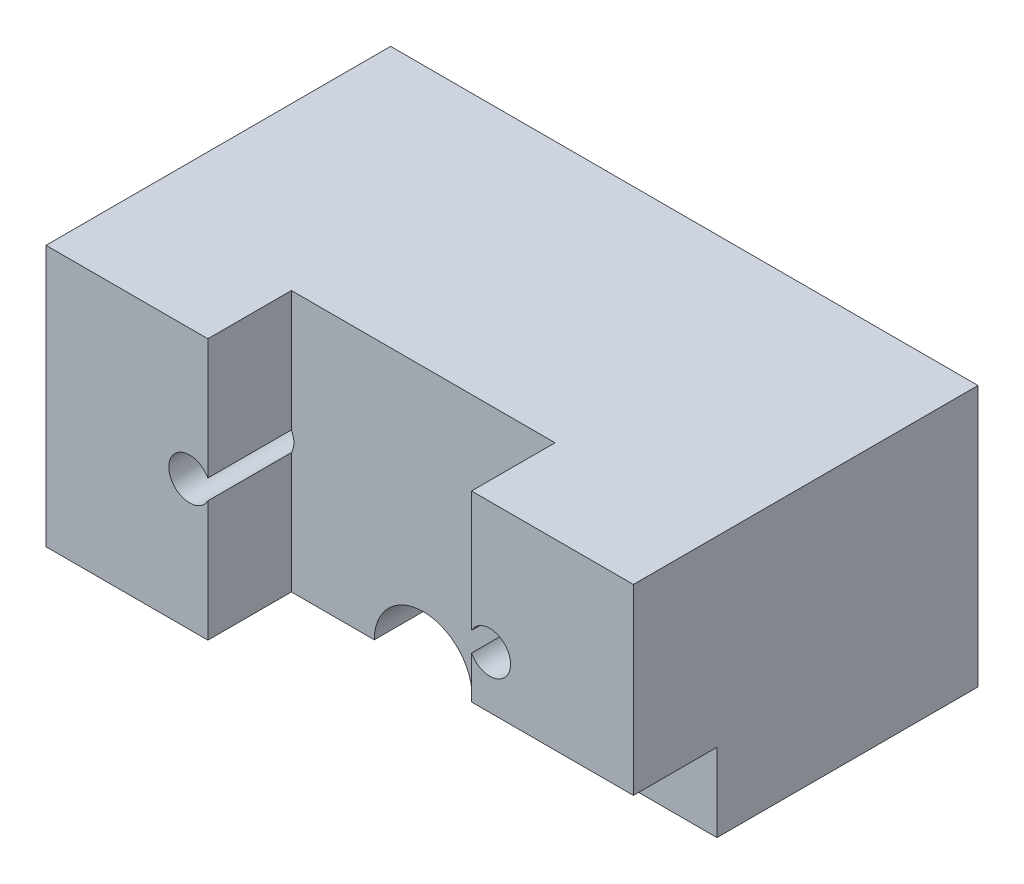
ISO-10303-21;
HEADER;
FILE_DESCRIPTION(('STEP AP214'),'2;1');
FILE_NAME('part.step','',(''),(''),'','','');
FILE_SCHEMA(('AUTOMOTIVE_DESIGN { 1 0 10303 214 1 1 1 1 }'));
ENDSEC;
DATA;
#1=APPLICATION_CONTEXT('core data for automotive mechanical design processes');
#2=APPLICATION_PROTOCOL_DEFINITION('international standard','automotive_design',2000,#1);
#3=PRODUCT_CONTEXT('',#1,'mechanical');
#4=PRODUCT('Part','Part','',(#3));
#5=PRODUCT_RELATED_PRODUCT_CATEGORY('part','',(#4));
#6=PRODUCT_DEFINITION_FORMATION('','',#4);
#7=PRODUCT_DEFINITION_CONTEXT('part definition',#1,'design');
#8=PRODUCT_DEFINITION('design','',#6,#7);
#9=PRODUCT_DEFINITION_SHAPE('','',#8);
#10=(LENGTH_UNIT() NAMED_UNIT(*) SI_UNIT(.MILLI.,.METRE.));
#11=(NAMED_UNIT(*) PLANE_ANGLE_UNIT() SI_UNIT($,.RADIAN.));
#12=(NAMED_UNIT(*) SI_UNIT($,.STERADIAN.) SOLID_ANGLE_UNIT());
#13=UNCERTAINTY_MEASURE_WITH_UNIT(LENGTH_MEASURE(1.E-05),#10,'distance_accuracy_value','');
#14=(GEOMETRIC_REPRESENTATION_CONTEXT(3) GLOBAL_UNCERTAINTY_ASSIGNED_CONTEXT((#13)) GLOBAL_UNIT_ASSIGNED_CONTEXT((#10,
#11,#12)) REPRESENTATION_CONTEXT('',''));
#15=CARTESIAN_POINT('',(0.,0.,0.));
#16=DIRECTION('',(0.,0.,1.));
#17=DIRECTION('',(1.,0.,0.));
#18=AXIS2_PLACEMENT_3D('',#15,#16,#17);
#19=CARTESIAN_POINT('',(0.,0.,-10.922));
#20=DIRECTION('',(0.,0.,-1.));
#21=DIRECTION('',(-1.,0.,0.));
#22=AXIS2_PLACEMENT_3D('',#19,#20,#21);
#23=PLANE('',#22);
#24=DIRECTION('',(0.,-1.,0.));
#25=VECTOR('',#24,1.);
#26=CARTESIAN_POINT('',(12.827,12.7,-10.922));
#27=LINE('',#26,#25);
#28=CARTESIAN_POINT('',(12.827,12.7,-10.922));
#29=VERTEX_POINT('',#28);
#30=CARTESIAN_POINT('',(12.827,0.957229591059528,-10.922));
#31=VERTEX_POINT('',#30);
#32=EDGE_CURVE('E43',#29,#31,#27,.T.);
#33=ORIENTED_EDGE('',*,*,#32,.T.);
#34=CARTESIAN_POINT('',(14.605,0.,-10.922));
#35=DIRECTION('',(0.,0.,-1.));
#36=DIRECTION('',(-1.,0.,0.));
#37=AXIS2_PLACEMENT_3D('',#34,#35,#36);
#38=CIRCLE('',#37,2.0193);
#39=CARTESIAN_POINT('',(12.827,-0.957229591059528,-10.922));
#40=VERTEX_POINT('',#39);
#41=EDGE_CURVE('E51',#40,#31,#38,.F.);
#42=ORIENTED_EDGE('',*,*,#41,.F.);
#43=CARTESIAN_POINT('',(12.827,-5.08,-10.922));
#44=VERTEX_POINT('',#43);
#45=EDGE_CURVE('E11',#40,#44,#27,.T.);
#46=ORIENTED_EDGE('',*,*,#45,.T.);
#47=DIRECTION('',(-1.,0.,0.));
#48=VECTOR('',#47,1.);
#49=CARTESIAN_POINT('',(12.827,-5.08,-10.922));
#50=LINE('',#49,#48);
#51=CARTESIAN_POINT('',(28.575,-5.08,-10.922));
#52=VERTEX_POINT('',#51);
#53=EDGE_CURVE('E197',#52,#44,#50,.T.);
#54=ORIENTED_EDGE('',*,*,#53,.F.);
#55=DIRECTION('',(0.,1.,0.));
#56=VECTOR('',#55,1.);
#57=CARTESIAN_POINT('',(28.575,-12.7,-10.922));
#58=LINE('',#57,#56);
#59=CARTESIAN_POINT('',(28.575,12.7,-10.922));
#60=VERTEX_POINT('',#59);
#61=EDGE_CURVE('E278',#52,#60,#58,.T.);
#62=ORIENTED_EDGE('',*,*,#61,.T.);
#63=DIRECTION('',(1.,0.,0.));
#64=VECTOR('',#63,1.);
#65=CARTESIAN_POINT('',(0.,12.7,-10.922));
#66=LINE('',#65,#64);
#67=EDGE_CURVE('E58',#29,#60,#66,.T.);
#68=ORIENTED_EDGE('',*,*,#67,.F.);
#69=EDGE_LOOP('',(#33,#42,#46,#54,#62,#68));
#70=FACE_BOUND('',#69,.T.);
#71=ADVANCED_FACE('F35',(#70),#23,.F.);
#72=CARTESIAN_POINT('',(12.7,-3.302,-28.575));
#73=DIRECTION('',(0.,-1.,0.));
#74=DIRECTION('',(0.,0.,-1.));
#75=AXIS2_PLACEMENT_3D('',#72,#73,#74);
#76=CONICAL_SURFACE('',#75,1.35255,1.02974425867665);
#77=CARTESIAN_POINT('',(12.7,-2.48930596973427,-28.575));
#78=VERTEX_POINT('',#77);
#79=VERTEX_LOOP('',#78);
#80=FACE_BOUND('',#79,.T.);
#81=CARTESIAN_POINT('',(12.7,-3.302,-28.575));
#82=DIRECTION('',(0.,-1.,0.));
#83=DIRECTION('',(0.,0.,-1.));
#84=AXIS2_PLACEMENT_3D('',#81,#82,#83);
#85=CIRCLE('',#84,1.35255);
#86=CARTESIAN_POINT('',(12.7,-3.302,-29.92755));
#87=VERTEX_POINT('',#86);
#88=EDGE_CURVE('E162',#87,#87,#85,.T.);
#89=ORIENTED_EDGE('',*,*,#88,.T.);
#90=EDGE_LOOP('',(#89));
#91=FACE_BOUND('',#90,.T.);
#92=ADVANCED_FACE('F350',(#80,#91),#76,.F.);
#93=CARTESIAN_POINT('',(12.7,-12.7,-28.575));
#94=DIRECTION('',(0.,-1.,0.));
#95=DIRECTION('',(0.,0.,-1.));
#96=AXIS2_PLACEMENT_3D('',#93,#94,#95);
#97=CYLINDRICAL_SURFACE('',#96,1.35255);
#98=ORIENTED_EDGE('',*,*,#88,.F.);
#99=EDGE_LOOP('',(#98));
#100=FACE_BOUND('',#99,.T.);
#101=CARTESIAN_POINT('',(12.7,-12.7,-28.575));
#102=DIRECTION('',(0.,-1.,0.));
#103=DIRECTION('',(0.,0.,-1.));
#104=AXIS2_PLACEMENT_3D('',#101,#102,#103);
#105=CIRCLE('',#104,1.35255);
#106=CARTESIAN_POINT('',(12.7,-12.7,-29.92755));
#107=VERTEX_POINT('',#106);
#108=EDGE_CURVE('E158',#107,#107,#105,.T.);
#109=ORIENTED_EDGE('',*,*,#108,.T.);
#110=EDGE_LOOP('',(#109));
#111=FACE_BOUND('',#110,.T.);
#112=ADVANCED_FACE('F152',(#100,#111),#97,.F.);
#113=CARTESIAN_POINT('',(-12.7,-3.302,-28.575));
#114=DIRECTION('',(0.,-1.,0.));
#115=DIRECTION('',(0.,0.,-1.));
#116=AXIS2_PLACEMENT_3D('',#113,#114,#115);
#117=CONICAL_SURFACE('',#116,1.35255,1.02974425867665);
#118=CARTESIAN_POINT('',(-12.7,-2.48930596973427,-28.575));
#119=VERTEX_POINT('',#118);
#120=VERTEX_LOOP('',#119);
#121=FACE_BOUND('',#120,.T.);
#122=CARTESIAN_POINT('',(-12.7,-3.302,-28.575));
#123=DIRECTION('',(0.,-1.,0.));
#124=DIRECTION('',(0.,0.,-1.));
#125=AXIS2_PLACEMENT_3D('',#122,#123,#124);
#126=CIRCLE('',#125,1.35255);
#127=CARTESIAN_POINT('',(-12.7,-3.302,-29.92755));
#128=VERTEX_POINT('',#127);
#129=EDGE_CURVE('E156',#128,#128,#126,.T.);
#130=ORIENTED_EDGE('',*,*,#129,.T.);
#131=EDGE_LOOP('',(#130));
#132=FACE_BOUND('',#131,.T.);
#133=ADVANCED_FACE('F148',(#121,#132),#117,.F.);
#134=CARTESIAN_POINT('',(14.605,0.,-38.989));
#135=DIRECTION('',(0.,0.,-1.));
#136=DIRECTION('',(-1.,0.,0.));
#137=AXIS2_PLACEMENT_3D('',#134,#135,#136);
#138=CYLINDRICAL_SURFACE('',#137,4.2164);
#139=CARTESIAN_POINT('',(14.605,0.,-38.989));
#140=DIRECTION('',(0.,0.,-1.));
#141=DIRECTION('',(-1.,0.,0.));
#142=AXIS2_PLACEMENT_3D('',#139,#140,#141);
#143=CIRCLE('',#142,4.2164);
#144=CARTESIAN_POINT('',(10.3886,0.,-38.989));
#145=VERTEX_POINT('',#144);
#146=EDGE_CURVE('E176',#145,#145,#143,.T.);
#147=ORIENTED_EDGE('',*,*,#146,.F.);
#148=EDGE_LOOP('',(#147));
#149=FACE_BOUND('',#148,.T.);
#150=CARTESIAN_POINT('',(14.605,0.,-44.45));
#151=DIRECTION('',(0.,0.,-1.));
#152=DIRECTION('',(-1.,0.,0.));
#153=AXIS2_PLACEMENT_3D('',#150,#151,#152);
#154=CIRCLE('',#153,4.2164);
#155=CARTESIAN_POINT('',(10.3886,0.,-44.45));
#156=VERTEX_POINT('',#155);
#157=EDGE_CURVE('E180',#156,#156,#154,.T.);
#158=ORIENTED_EDGE('',*,*,#157,.T.);
#159=EDGE_LOOP('',(#158));
#160=FACE_BOUND('',#159,.T.);
#161=ADVANCED_FACE('F151',(#149,#160),#138,.F.);
#162=CARTESIAN_POINT('',(-14.605,0.,-38.989));
#163=DIRECTION('',(0.,0.,-1.));
#164=DIRECTION('',(-1.,0.,0.));
#165=AXIS2_PLACEMENT_3D('',#162,#163,#164);
#166=CYLINDRICAL_SURFACE('',#165,4.2164);
#167=CARTESIAN_POINT('',(-14.605,0.,-38.989));
#168=DIRECTION('',(0.,0.,-1.));
#169=DIRECTION('',(-1.,0.,0.));
#170=AXIS2_PLACEMENT_3D('',#167,#168,#169);
#171=CIRCLE('',#170,4.2164);
#172=CARTESIAN_POINT('',(-18.8214,0.,-38.989));
#173=VERTEX_POINT('',#172);
#174=EDGE_CURVE('E170',#173,#173,#171,.T.);
#175=ORIENTED_EDGE('',*,*,#174,.F.);
#176=EDGE_LOOP('',(#175));
#177=FACE_BOUND('',#176,.T.);
#178=CARTESIAN_POINT('',(-14.605,0.,-44.45));
#179=DIRECTION('',(0.,0.,-1.));
#180=DIRECTION('',(-1.,0.,0.));
#181=AXIS2_PLACEMENT_3D('',#178,#179,#180);
#182=CIRCLE('',#181,4.2164);
#183=CARTESIAN_POINT('',(-18.8214,0.,-44.45));
#184=VERTEX_POINT('',#183);
#185=EDGE_CURVE('E169',#184,#184,#182,.T.);
#186=ORIENTED_EDGE('',*,*,#185,.T.);
#187=EDGE_LOOP('',(#186));
#188=FACE_BOUND('',#187,.T.);
#189=ADVANCED_FACE('F476',(#177,#188),#166,.F.);
#190=CARTESIAN_POINT('',(-14.605,0.,-38.989));
#191=DIRECTION('',(0.,0.,-1.));
#192=DIRECTION('',(-1.,0.,0.));
#193=AXIS2_PLACEMENT_3D('',#190,#191,#192);
#194=PLANE('',#193);
#195=ORIENTED_EDGE('',*,*,#174,.T.);
#196=EDGE_LOOP('',(#195));
#197=FACE_BOUND('',#196,.T.);
#198=CARTESIAN_POINT('',(-14.605,0.,-38.989));
#199=DIRECTION('',(0.,0.,-1.));
#200=DIRECTION('',(-1.,0.,0.));
#201=AXIS2_PLACEMENT_3D('',#198,#199,#200);
#202=CIRCLE('',#201,2.0193);
#203=CARTESIAN_POINT('',(-16.6243,0.,-38.989));
#204=VERTEX_POINT('',#203);
#205=EDGE_CURVE('E173',#204,#204,#202,.F.);
#206=ORIENTED_EDGE('',*,*,#205,.T.);
#207=EDGE_LOOP('',(#206));
#208=FACE_BOUND('',#207,.T.);
#209=ADVANCED_FACE('F471',(#197,#208),#194,.T.);
#210=CARTESIAN_POINT('',(14.605,0.,-38.989));
#211=DIRECTION('',(0.,0.,-1.));
#212=DIRECTION('',(-1.,0.,0.));
#213=AXIS2_PLACEMENT_3D('',#210,#211,#212);
#214=PLANE('',#213);
#215=ORIENTED_EDGE('',*,*,#146,.T.);
#216=EDGE_LOOP('',(#215));
#217=FACE_BOUND('',#216,.T.);
#218=CARTESIAN_POINT('',(14.605,0.,-38.989));
#219=DIRECTION('',(0.,0.,-1.));
#220=DIRECTION('',(-1.,0.,0.));
#221=AXIS2_PLACEMENT_3D('',#218,#219,#220);
#222=CIRCLE('',#221,2.0193);
#223=CARTESIAN_POINT('',(12.5857,0.,-38.989));
#224=VERTEX_POINT('',#223);
#225=EDGE_CURVE('E179',#224,#224,#222,.F.);
#226=ORIENTED_EDGE('',*,*,#225,.T.);
#227=EDGE_LOOP('',(#226));
#228=FACE_BOUND('',#227,.T.);
#229=ADVANCED_FACE('F371',(#217,#228),#214,.T.);
#230=CARTESIAN_POINT('',(0.,-12.7,0.));
#231=DIRECTION('',(0.,-1.,0.));
#232=DIRECTION('',(0.,0.,-1.));
#233=AXIS2_PLACEMENT_3D('',#230,#231,#232);
#234=PLANE('',#233);
#235=ORIENTED_EDGE('',*,*,#108,.F.);
#236=EDGE_LOOP('',(#235));
#237=FACE_BOUND('',#236,.T.);
#238=DIRECTION('',(0.,0.,-1.));
#239=VECTOR('',#238,1.);
#240=CARTESIAN_POINT('',(28.575,-12.7,44.45));
#241=LINE('',#240,#239);
#242=CARTESIAN_POINT('',(28.575,-12.7,-19.05));
#243=VERTEX_POINT('',#242);
#244=CARTESIAN_POINT('',(28.575,-12.7,-44.45));
#245=VERTEX_POINT('',#244);
#246=EDGE_CURVE('E248',#243,#245,#241,.T.);
#247=ORIENTED_EDGE('',*,*,#246,.F.);
#248=DIRECTION('',(-1.,0.,0.));
#249=VECTOR('',#248,1.);
#250=CARTESIAN_POINT('',(12.827,-12.7,-19.05));
#251=LINE('',#250,#249);
#252=CARTESIAN_POINT('',(4.7625,-12.7,-19.05));
#253=VERTEX_POINT('',#252);
#254=EDGE_CURVE('E206',#243,#253,#251,.T.);
#255=ORIENTED_EDGE('',*,*,#254,.T.);
#256=DIRECTION('',(0.,0.,-1.));
#257=VECTOR('',#256,1.);
#258=CARTESIAN_POINT('',(4.7625,-12.7,-19.05));
#259=LINE('',#258,#257);
#260=CARTESIAN_POINT('',(4.7625,-12.7,-44.45));
#261=VERTEX_POINT('',#260);
#262=EDGE_CURVE('E260',#261,#253,#259,.F.);
#263=ORIENTED_EDGE('',*,*,#262,.F.);
#264=DIRECTION('',(-1.,0.,0.));
#265=VECTOR('',#264,1.);
#266=CARTESIAN_POINT('',(-28.575,-12.7,-44.45));
#267=LINE('',#266,#265);
#268=EDGE_CURVE('E251',#245,#261,#267,.T.);
#269=ORIENTED_EDGE('',*,*,#268,.F.);
#270=EDGE_LOOP('',(#247,#255,#263,#269));
#271=FACE_BOUND('',#270,.T.);
#272=ADVANCED_FACE('F329',(#237,#271),#234,.T.);
#273=CARTESIAN_POINT('',(-12.7,-12.7,-28.575));
#274=DIRECTION('',(0.,-1.,0.));
#275=DIRECTION('',(0.,0.,-1.));
#276=AXIS2_PLACEMENT_3D('',#273,#274,#275);
#277=CYLINDRICAL_SURFACE('',#276,1.35255);
#278=ORIENTED_EDGE('',*,*,#129,.F.);
#279=EDGE_LOOP('',(#278));
#280=FACE_BOUND('',#279,.T.);
#281=CARTESIAN_POINT('',(-12.7,-12.7,-28.575));
#282=DIRECTION('',(0.,-1.,0.));
#283=DIRECTION('',(0.,0.,-1.));
#284=AXIS2_PLACEMENT_3D('',#281,#282,#283);
#285=CIRCLE('',#284,1.35255);
#286=CARTESIAN_POINT('',(-12.7,-12.7,-29.92755));
#287=VERTEX_POINT('',#286);
#288=EDGE_CURVE('E159',#287,#287,#285,.T.);
#289=ORIENTED_EDGE('',*,*,#288,.T.);
#290=EDGE_LOOP('',(#289));
#291=FACE_BOUND('',#290,.T.);
#292=ADVANCED_FACE('F367',(#280,#291),#277,.F.);
#293=CARTESIAN_POINT('',(0.,-12.7,-19.05));
#294=DIRECTION('',(0.,0.,-1.));
#295=DIRECTION('',(-1.,0.,0.));
#296=AXIS2_PLACEMENT_3D('',#293,#294,#295);
#297=CYLINDRICAL_SURFACE('',#296,4.7625);
#298=DIRECTION('',(0.,0.,-1.));
#299=VECTOR('',#298,1.);
#300=CARTESIAN_POINT('',(-4.7625,-12.7,-19.05));
#301=LINE('',#300,#299);
#302=CARTESIAN_POINT('',(-4.7625,-12.7,-19.05));
#303=VERTEX_POINT('',#302);
#304=CARTESIAN_POINT('',(-4.7625,-12.7,-44.45));
#305=VERTEX_POINT('',#304);
#306=EDGE_CURVE('E265',#303,#305,#301,.T.);
#307=ORIENTED_EDGE('',*,*,#306,.T.);
#308=CARTESIAN_POINT('',(0.,-12.7,-44.45));
#309=DIRECTION('',(0.,0.,-1.));
#310=DIRECTION('',(-1.,0.,0.));
#311=AXIS2_PLACEMENT_3D('',#308,#309,#310);
#312=CIRCLE('',#311,4.7625);
#313=EDGE_CURVE('E236',#305,#261,#312,.T.);
#314=ORIENTED_EDGE('',*,*,#313,.T.);
#315=ORIENTED_EDGE('',*,*,#262,.T.);
#316=CARTESIAN_POINT('',(0.,-12.7,-19.05));
#317=DIRECTION('',(0.,0.,-1.));
#318=DIRECTION('',(-1.,0.,0.));
#319=AXIS2_PLACEMENT_3D('',#316,#317,#318);
#320=CIRCLE('',#319,4.7625);
#321=EDGE_CURVE('E237',#303,#253,#320,.T.);
#322=ORIENTED_EDGE('',*,*,#321,.F.);
#323=EDGE_LOOP('',(#307,#314,#315,#322));
#324=FACE_BOUND('',#323,.T.);
#325=ADVANCED_FACE('F321',(#324),#297,.F.);
#326=CARTESIAN_POINT('',(-28.575,-12.7,-44.45));
#327=DIRECTION('',(0.,0.,-1.));
#328=DIRECTION('',(-1.,0.,0.));
#329=AXIS2_PLACEMENT_3D('',#326,#327,#328);
#330=PLANE('',#329);
#331=ORIENTED_EDGE('',*,*,#185,.F.);
#332=EDGE_LOOP('',(#331));
#333=FACE_BOUND('',#332,.T.);
#334=ORIENTED_EDGE('',*,*,#157,.F.);
#335=EDGE_LOOP('',(#334));
#336=FACE_BOUND('',#335,.T.);
#337=ORIENTED_EDGE('',*,*,#313,.F.);
#338=CARTESIAN_POINT('',(-28.575,-12.7,-44.45));
#339=VERTEX_POINT('',#338);
#340=EDGE_CURVE('E250',#305,#339,#267,.T.);
#341=ORIENTED_EDGE('',*,*,#340,.T.);
#342=DIRECTION('',(0.,1.,0.));
#343=VECTOR('',#342,1.);
#344=CARTESIAN_POINT('',(-28.575,-12.7,-44.45));
#345=LINE('',#344,#343);
#346=CARTESIAN_POINT('',(-28.575,12.7,-44.45));
#347=VERTEX_POINT('',#346);
#348=EDGE_CURVE('E258',#339,#347,#345,.T.);
#349=ORIENTED_EDGE('',*,*,#348,.T.);
#350=DIRECTION('',(-1.,0.,0.));
#351=VECTOR('',#350,1.);
#352=CARTESIAN_POINT('',(-28.575,12.7,-44.45));
#353=LINE('',#352,#351);
#354=CARTESIAN_POINT('',(28.575,12.7,-44.45));
#355=VERTEX_POINT('',#354);
#356=EDGE_CURVE('E242',#355,#347,#353,.T.);
#357=ORIENTED_EDGE('',*,*,#356,.F.);
#358=DIRECTION('',(0.,1.,0.));
#359=VECTOR('',#358,1.);
#360=CARTESIAN_POINT('',(28.575,-12.7,-44.45));
#361=LINE('',#360,#359);
#362=EDGE_CURVE('E257',#245,#355,#361,.T.);
#363=ORIENTED_EDGE('',*,*,#362,.F.);
#364=ORIENTED_EDGE('',*,*,#268,.T.);
#365=EDGE_LOOP('',(#337,#341,#349,#357,#363,#364));
#366=FACE_BOUND('',#365,.T.);
#367=ADVANCED_FACE('F324',(#333,#336,#366),#330,.T.);
#368=DIRECTION('',(0.,0.,1.));
#369=VECTOR('',#368,1.);
#370=CARTESIAN_POINT('',(-12.827,-12.7,-10.922));
#371=LINE('',#370,#369);
#372=CARTESIAN_POINT('',(-12.827,-12.7,-19.05));
#373=VERTEX_POINT('',#372);
#374=CARTESIAN_POINT('',(-12.827,-12.7,-10.922));
#375=VERTEX_POINT('',#374);
#376=EDGE_CURVE('E202',#373,#375,#371,.T.);
#377=ORIENTED_EDGE('',*,*,#376,.T.);
#378=DIRECTION('',(1.,0.,0.));
#379=VECTOR('',#378,1.);
#380=CARTESIAN_POINT('',(-16.002,-12.7,-10.922));
#381=LINE('',#380,#379);
#382=CARTESIAN_POINT('',(-28.575,-12.7,-10.922));
#383=VERTEX_POINT('',#382);
#384=EDGE_CURVE('E229',#383,#375,#381,.T.);
#385=ORIENTED_EDGE('',*,*,#384,.F.);
#386=DIRECTION('',(0.,0.,1.));
#387=VECTOR('',#386,1.);
#388=CARTESIAN_POINT('',(-28.575,-12.7,44.45));
#389=LINE('',#388,#387);
#390=EDGE_CURVE('E254',#339,#383,#389,.T.);
#391=ORIENTED_EDGE('',*,*,#390,.F.);
#392=ORIENTED_EDGE('',*,*,#340,.F.);
#393=ORIENTED_EDGE('',*,*,#306,.F.);
#394=EDGE_CURVE('E205',#303,#373,#251,.T.);
#395=ORIENTED_EDGE('',*,*,#394,.T.);
#396=EDGE_LOOP('',(#377,#385,#391,#392,#393,#395));
#397=FACE_BOUND('',#396,.T.);
#398=ORIENTED_EDGE('',*,*,#288,.F.);
#399=EDGE_LOOP('',(#398));
#400=FACE_BOUND('',#399,.T.);
#401=ADVANCED_FACE('F316',(#397,#400),#234,.T.);
#402=CARTESIAN_POINT('',(14.605,0.,12.7));
#403=DIRECTION('',(0.,0.,-1.));
#404=DIRECTION('',(-1.,0.,0.));
#405=AXIS2_PLACEMENT_3D('',#402,#403,#404);
#406=CYLINDRICAL_SURFACE('',#405,2.0193);
#407=DIRECTION('',(0.,0.,-1.));
#408=VECTOR('',#407,1.);
#409=CARTESIAN_POINT('',(12.827,-0.957229591059528,12.7));
#410=LINE('',#409,#408);
#411=CARTESIAN_POINT('',(12.827,-0.957229591059528,-19.05));
#412=VERTEX_POINT('',#411);
#413=EDGE_CURVE('E185',#412,#40,#410,.F.);
#414=ORIENTED_EDGE('',*,*,#413,.T.);
#415=ORIENTED_EDGE('',*,*,#41,.T.);
#416=DIRECTION('',(0.,0.,-1.));
#417=VECTOR('',#416,1.);
#418=CARTESIAN_POINT('',(12.827,0.957229591059528,12.7));
#419=LINE('',#418,#417);
#420=CARTESIAN_POINT('',(12.827,0.957229591059528,-19.05));
#421=VERTEX_POINT('',#420);
#422=EDGE_CURVE('E187',#31,#421,#419,.T.);
#423=ORIENTED_EDGE('',*,*,#422,.T.);
#424=CARTESIAN_POINT('',(14.605,0.,-19.05));
#425=DIRECTION('',(0.,0.,1.));
#426=DIRECTION('',(1.,0.,0.));
#427=AXIS2_PLACEMENT_3D('',#424,#425,#426);
#428=CIRCLE('',#427,2.0193);
#429=EDGE_CURVE('E189',#421,#412,#428,.T.);
#430=ORIENTED_EDGE('',*,*,#429,.T.);
#431=EDGE_LOOP('',(#414,#415,#423,#430));
#432=FACE_BOUND('',#431,.T.);
#433=ORIENTED_EDGE('',*,*,#225,.F.);
#434=EDGE_LOOP('',(#433));
#435=FACE_BOUND('',#434,.T.);
#436=ADVANCED_FACE('F342',(#432,#435),#406,.F.);
#437=CARTESIAN_POINT('',(28.575,-12.7,44.45));
#438=DIRECTION('',(1.,0.,0.));
#439=DIRECTION('',(0.,0.,-1.));
#440=AXIS2_PLACEMENT_3D('',#437,#438,#439);
#441=PLANE('',#440);
#442=ORIENTED_EDGE('',*,*,#61,.F.);
#443=DIRECTION('',(0.,0.,1.));
#444=VECTOR('',#443,1.);
#445=CARTESIAN_POINT('',(28.575,-5.08,44.45));
#446=LINE('',#445,#444);
#447=CARTESIAN_POINT('',(28.575,-5.08,-19.05));
#448=VERTEX_POINT('',#447);
#449=EDGE_CURVE('E230',#448,#52,#446,.T.);
#450=ORIENTED_EDGE('',*,*,#449,.F.);
#451=DIRECTION('',(0.,-1.,0.));
#452=VECTOR('',#451,1.);
#453=CARTESIAN_POINT('',(28.575,-5.08,-19.05));
#454=LINE('',#453,#452);
#455=EDGE_CURVE('E199',#448,#243,#454,.T.);
#456=ORIENTED_EDGE('',*,*,#455,.T.);
#457=ORIENTED_EDGE('',*,*,#246,.T.);
#458=ORIENTED_EDGE('',*,*,#362,.T.);
#459=DIRECTION('',(0.,0.,-1.));
#460=VECTOR('',#459,1.);
#461=CARTESIAN_POINT('',(28.575,12.7,44.45));
#462=LINE('',#461,#460);
#463=EDGE_CURVE('E239',#60,#355,#462,.T.);
#464=ORIENTED_EDGE('',*,*,#463,.F.);
#465=EDGE_LOOP('',(#442,#450,#456,#457,#458,#464));
#466=FACE_BOUND('',#465,.T.);
#467=ADVANCED_FACE('F333',(#466),#441,.T.);
#468=CARTESIAN_POINT('',(0.,12.7,0.));
#469=DIRECTION('',(0.,-1.,0.));
#470=DIRECTION('',(0.,0.,-1.));
#471=AXIS2_PLACEMENT_3D('',#468,#469,#470);
#472=PLANE('',#471);
#473=DIRECTION('',(0.,0.,1.));
#474=VECTOR('',#473,1.);
#475=CARTESIAN_POINT('',(-28.575,12.7,44.45));
#476=LINE('',#475,#474);
#477=CARTESIAN_POINT('',(-28.575,12.7,-10.922));
#478=VERTEX_POINT('',#477);
#479=EDGE_CURVE('E245',#347,#478,#476,.T.);
#480=ORIENTED_EDGE('',*,*,#479,.T.);
#481=CARTESIAN_POINT('',(-12.827,12.7,-10.922));
#482=VERTEX_POINT('',#481);
#483=EDGE_CURVE('E276',#478,#482,#66,.T.);
#484=ORIENTED_EDGE('',*,*,#483,.T.);
#485=DIRECTION('',(0.,0.,1.));
#486=VECTOR('',#485,1.);
#487=CARTESIAN_POINT('',(-12.827,12.7,-10.922));
#488=LINE('',#487,#486);
#489=CARTESIAN_POINT('',(-12.827,12.7,-19.05));
#490=VERTEX_POINT('',#489);
#491=EDGE_CURVE('E209',#490,#482,#488,.T.);
#492=ORIENTED_EDGE('',*,*,#491,.F.);
#493=DIRECTION('',(-1.,0.,0.));
#494=VECTOR('',#493,1.);
#495=CARTESIAN_POINT('',(12.827,12.7,-19.05));
#496=LINE('',#495,#494);
#497=CARTESIAN_POINT('',(12.827,12.7,-19.05));
#498=VERTEX_POINT('',#497);
#499=EDGE_CURVE('E215',#498,#490,#496,.T.);
#500=ORIENTED_EDGE('',*,*,#499,.F.);
#501=DIRECTION('',(0.,0.,-1.));
#502=VECTOR('',#501,1.);
#503=CARTESIAN_POINT('',(12.827,12.7,-10.922));
#504=LINE('',#503,#502);
#505=EDGE_CURVE('E212',#29,#498,#504,.T.);
#506=ORIENTED_EDGE('',*,*,#505,.F.);
#507=ORIENTED_EDGE('',*,*,#67,.T.);
#508=ORIENTED_EDGE('',*,*,#463,.T.);
#509=ORIENTED_EDGE('',*,*,#356,.T.);
#510=EDGE_LOOP('',(#480,#484,#492,#500,#506,#507,#508,#509));
#511=FACE_BOUND('',#510,.T.);
#512=ADVANCED_FACE('F308',(#511),#472,.F.);
#513=CARTESIAN_POINT('',(12.827,12.7,-19.05));
#514=DIRECTION('',(0.,0.,1.));
#515=DIRECTION('',(1.,0.,0.));
#516=AXIS2_PLACEMENT_3D('',#513,#514,#515);
#517=PLANE('',#516);
#518=CARTESIAN_POINT('',(-14.605,0.,-19.05));
#519=DIRECTION('',(0.,0.,1.));
#520=DIRECTION('',(1.,0.,0.));
#521=AXIS2_PLACEMENT_3D('',#518,#519,#520);
#522=CIRCLE('',#521,2.0193);
#523=CARTESIAN_POINT('',(-12.827,-0.95722959105955,-19.05));
#524=VERTEX_POINT('',#523);
#525=CARTESIAN_POINT('',(-12.827,0.957229591059551,-19.05));
#526=VERTEX_POINT('',#525);
#527=EDGE_CURVE('E183',#524,#526,#522,.T.);
#528=ORIENTED_EDGE('',*,*,#527,.F.);
#529=DIRECTION('',(0.,-1.,0.));
#530=VECTOR('',#529,1.);
#531=CARTESIAN_POINT('',(-12.827,12.7,-19.05));
#532=LINE('',#531,#530);
#533=EDGE_CURVE('E217',#524,#373,#532,.T.);
#534=ORIENTED_EDGE('',*,*,#533,.T.);
#535=ORIENTED_EDGE('',*,*,#394,.F.);
#536=ORIENTED_EDGE('',*,*,#321,.T.);
#537=ORIENTED_EDGE('',*,*,#254,.F.);
#538=ORIENTED_EDGE('',*,*,#455,.F.);
#539=DIRECTION('',(1.,0.,0.));
#540=VECTOR('',#539,1.);
#541=CARTESIAN_POINT('',(12.827,-5.08,-19.05));
#542=LINE('',#541,#540);
#543=CARTESIAN_POINT('',(12.827,-5.08,-19.05));
#544=VERTEX_POINT('',#543);
#545=EDGE_CURVE('E194',#544,#448,#542,.T.);
#546=ORIENTED_EDGE('',*,*,#545,.F.);
#547=DIRECTION('',(0.,-1.,0.));
#548=VECTOR('',#547,1.);
#549=CARTESIAN_POINT('',(12.827,12.7,-19.05));
#550=LINE('',#549,#548);
#551=EDGE_CURVE('E221',#412,#544,#550,.T.);
#552=ORIENTED_EDGE('',*,*,#551,.F.);
#553=ORIENTED_EDGE('',*,*,#429,.F.);
#554=EDGE_CURVE('E222',#498,#421,#550,.T.);
#555=ORIENTED_EDGE('',*,*,#554,.F.);
#556=ORIENTED_EDGE('',*,*,#499,.T.);
#557=EDGE_CURVE('E218',#490,#526,#532,.T.);
#558=ORIENTED_EDGE('',*,*,#557,.T.);
#559=EDGE_LOOP('',(#528,#534,#535,#536,#537,#538,#546,#552,#553,#555,#556,#558));
#560=FACE_BOUND('',#559,.T.);
#561=ADVANCED_FACE('F299',(#560),#517,.T.);
#562=CARTESIAN_POINT('',(-14.605,0.,12.7));
#563=DIRECTION('',(0.,0.,-1.));
#564=DIRECTION('',(-1.,0.,0.));
#565=AXIS2_PLACEMENT_3D('',#562,#563,#564);
#566=CYLINDRICAL_SURFACE('',#565,2.0193);
#567=DIRECTION('',(0.,0.,-1.));
#568=VECTOR('',#567,1.);
#569=CARTESIAN_POINT('',(-12.827,0.95722959105955,12.7));
#570=LINE('',#569,#568);
#571=CARTESIAN_POINT('',(-12.827,0.95722959105955,-10.922));
#572=VERTEX_POINT('',#571);
#573=EDGE_CURVE('E267',#526,#572,#570,.F.);
#574=ORIENTED_EDGE('',*,*,#573,.T.);
#575=CARTESIAN_POINT('',(-14.605,0.,-10.922));
#576=DIRECTION('',(0.,0.,-1.));
#577=DIRECTION('',(-1.,0.,0.));
#578=AXIS2_PLACEMENT_3D('',#575,#576,#577);
#579=CIRCLE('',#578,2.0193);
#580=CARTESIAN_POINT('',(-12.827,-0.95722959105955,-10.922));
#581=VERTEX_POINT('',#580);
#582=EDGE_CURVE('E38',#572,#581,#579,.F.);
#583=ORIENTED_EDGE('',*,*,#582,.T.);
#584=DIRECTION('',(0.,0.,-1.));
#585=VECTOR('',#584,1.);
#586=CARTESIAN_POINT('',(-12.827,-0.95722959105955,12.7));
#587=LINE('',#586,#585);
#588=EDGE_CURVE('E270',#581,#524,#587,.T.);
#589=ORIENTED_EDGE('',*,*,#588,.T.);
#590=ORIENTED_EDGE('',*,*,#527,.T.);
#591=EDGE_LOOP('',(#574,#583,#589,#590));
#592=FACE_BOUND('',#591,.T.);
#593=ORIENTED_EDGE('',*,*,#205,.F.);
#594=EDGE_LOOP('',(#593));
#595=FACE_BOUND('',#594,.T.);
#596=ADVANCED_FACE('F283',(#592,#595),#566,.F.);
#597=CARTESIAN_POINT('',(-12.827,12.7,-10.922));
#598=DIRECTION('',(1.,0.,0.));
#599=DIRECTION('',(0.,0.,-1.));
#600=AXIS2_PLACEMENT_3D('',#597,#598,#599);
#601=PLANE('',#600);
#602=ORIENTED_EDGE('',*,*,#573,.F.);
#603=ORIENTED_EDGE('',*,*,#557,.F.);
#604=ORIENTED_EDGE('',*,*,#491,.T.);
#605=DIRECTION('',(0.,-1.,0.));
#606=VECTOR('',#605,1.);
#607=CARTESIAN_POINT('',(-12.827,12.7,-10.922));
#608=LINE('',#607,#606);
#609=EDGE_CURVE('E226',#482,#572,#608,.T.);
#610=ORIENTED_EDGE('',*,*,#609,.T.);
#611=EDGE_LOOP('',(#602,#603,#604,#610));
#612=FACE_BOUND('',#611,.T.);
#613=ADVANCED_FACE('F303',(#612),#601,.T.);
#614=CARTESIAN_POINT('',(12.827,12.7,-10.922));
#615=DIRECTION('',(-1.,0.,0.));
#616=DIRECTION('',(0.,0.,1.));
#617=AXIS2_PLACEMENT_3D('',#614,#615,#616);
#618=PLANE('',#617);
#619=ORIENTED_EDGE('',*,*,#413,.F.);
#620=ORIENTED_EDGE('',*,*,#551,.T.);
#621=DIRECTION('',(0.,0.,-1.));
#622=VECTOR('',#621,1.);
#623=CARTESIAN_POINT('',(12.827,-5.08,-10.922));
#624=LINE('',#623,#622);
#625=EDGE_CURVE('E191',#44,#544,#624,.T.);
#626=ORIENTED_EDGE('',*,*,#625,.F.);
#627=ORIENTED_EDGE('',*,*,#45,.F.);
#628=EDGE_LOOP('',(#619,#620,#626,#627));
#629=FACE_BOUND('',#628,.T.);
#630=ADVANCED_FACE('F341',(#629),#618,.T.);
#631=CARTESIAN_POINT('',(0.,-5.08,0.));
#632=DIRECTION('',(0.,-1.,0.));
#633=DIRECTION('',(0.,0.,-1.));
#634=AXIS2_PLACEMENT_3D('',#631,#632,#633);
#635=PLANE('',#634);
#636=ORIENTED_EDGE('',*,*,#449,.T.);
#637=ORIENTED_EDGE('',*,*,#53,.T.);
#638=ORIENTED_EDGE('',*,*,#625,.T.);
#639=ORIENTED_EDGE('',*,*,#545,.T.);
#640=EDGE_LOOP('',(#636,#637,#638,#639));
#641=FACE_BOUND('',#640,.T.);
#642=ADVANCED_FACE('F335',(#641),#635,.T.);
#643=ORIENTED_EDGE('',*,*,#422,.F.);
#644=ORIENTED_EDGE('',*,*,#32,.F.);
#645=ORIENTED_EDGE('',*,*,#505,.T.);
#646=ORIENTED_EDGE('',*,*,#554,.T.);
#647=EDGE_LOOP('',(#643,#644,#645,#646));
#648=FACE_BOUND('',#647,.T.);
#649=ADVANCED_FACE('F346',(#648),#618,.T.);
#650=ORIENTED_EDGE('',*,*,#588,.F.);
#651=EDGE_CURVE('E224',#581,#375,#608,.T.);
#652=ORIENTED_EDGE('',*,*,#651,.T.);
#653=ORIENTED_EDGE('',*,*,#376,.F.);
#654=ORIENTED_EDGE('',*,*,#533,.F.);
#655=EDGE_LOOP('',(#650,#652,#653,#654));
#656=FACE_BOUND('',#655,.T.);
#657=ADVANCED_FACE('F296',(#656),#601,.T.);
#658=CARTESIAN_POINT('',(-28.575,-12.7,44.45));
#659=DIRECTION('',(-1.,0.,0.));
#660=DIRECTION('',(0.,0.,1.));
#661=AXIS2_PLACEMENT_3D('',#658,#659,#660);
#662=PLANE('',#661);
#663=DIRECTION('',(0.,-1.,0.));
#664=VECTOR('',#663,1.);
#665=CARTESIAN_POINT('',(-28.575,-5.08,-10.922));
#666=LINE('',#665,#664);
#667=EDGE_CURVE('E233',#478,#383,#666,.T.);
#668=ORIENTED_EDGE('',*,*,#667,.F.);
#669=ORIENTED_EDGE('',*,*,#479,.F.);
#670=ORIENTED_EDGE('',*,*,#348,.F.);
#671=ORIENTED_EDGE('',*,*,#390,.T.);
#672=EDGE_LOOP('',(#668,#669,#670,#671));
#673=FACE_BOUND('',#672,.T.);
#674=ADVANCED_FACE('F312',(#673),#662,.T.);
#675=CARTESIAN_POINT('',(-16.002,-5.08,-10.922));
#676=DIRECTION('',(0.,0.,-1.));
#677=DIRECTION('',(-1.,0.,0.));
#678=AXIS2_PLACEMENT_3D('',#675,#676,#677);
#679=PLANE('',#678);
#680=ORIENTED_EDGE('',*,*,#384,.T.);
#681=ORIENTED_EDGE('',*,*,#651,.F.);
#682=ORIENTED_EDGE('',*,*,#582,.F.);
#683=ORIENTED_EDGE('',*,*,#609,.F.);
#684=ORIENTED_EDGE('',*,*,#483,.F.);
#685=ORIENTED_EDGE('',*,*,#667,.T.);
#686=EDGE_LOOP('',(#680,#681,#682,#683,#684,#685));
#687=FACE_BOUND('',#686,.T.);
#688=ADVANCED_FACE('F291',(#687),#679,.F.);
#689=CLOSED_SHELL('',(#71,#92,#112,#133,#161,#189,#209,#229,#272,#292,#325,#367,#401,#436,#467,
#512,#561,#596,#613,#630,#642,#649,#657,#674,#688));
#690=MANIFOLD_SOLID_BREP('B2',#689);
#691=ADVANCED_BREP_SHAPE_REPRESENTATION('',(#18,#690),#14);
#692=SHAPE_DEFINITION_REPRESENTATION(#9,#691);
ENDSEC;
END-ISO-10303-21;
